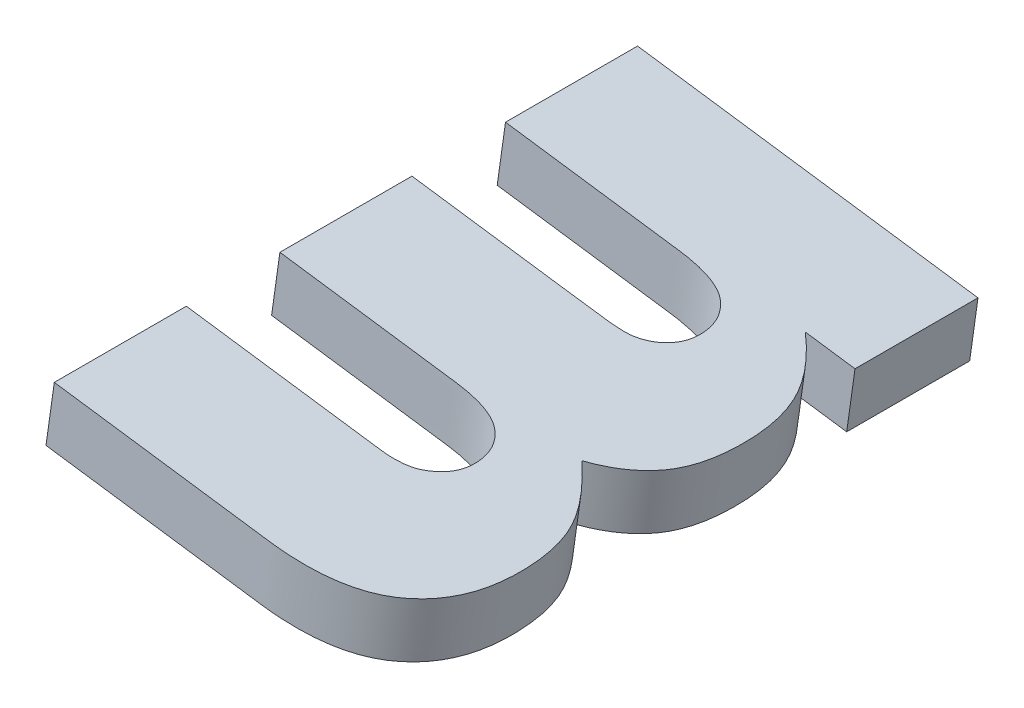
ISO-10303-21;
HEADER;
FILE_DESCRIPTION(('STEP AP214'),'2;1');
FILE_NAME('part.step','',(''),(''),'','','');
FILE_SCHEMA(('AUTOMOTIVE_DESIGN { 1 0 10303 214 1 1 1 1 }'));
ENDSEC;
DATA;
#1=APPLICATION_CONTEXT('core data for automotive mechanical design processes');
#2=APPLICATION_PROTOCOL_DEFINITION('international standard','automotive_design',2000,#1);
#3=PRODUCT_CONTEXT('',#1,'mechanical');
#4=PRODUCT('Part','Part','',(#3));
#5=PRODUCT_RELATED_PRODUCT_CATEGORY('part','',(#4));
#6=PRODUCT_DEFINITION_FORMATION('','',#4);
#7=PRODUCT_DEFINITION_CONTEXT('part definition',#1,'design');
#8=PRODUCT_DEFINITION('design','',#6,#7);
#9=PRODUCT_DEFINITION_SHAPE('','',#8);
#10=(LENGTH_UNIT() NAMED_UNIT(*) SI_UNIT(.MILLI.,.METRE.));
#11=(NAMED_UNIT(*) PLANE_ANGLE_UNIT() SI_UNIT($,.RADIAN.));
#12=(NAMED_UNIT(*) SI_UNIT($,.STERADIAN.) SOLID_ANGLE_UNIT());
#13=UNCERTAINTY_MEASURE_WITH_UNIT(LENGTH_MEASURE(1.E-05),#10,'distance_accuracy_value','');
#14=(GEOMETRIC_REPRESENTATION_CONTEXT(3) GLOBAL_UNCERTAINTY_ASSIGNED_CONTEXT((#13)) GLOBAL_UNIT_ASSIGNED_CONTEXT((#10,
#11,#12)) REPRESENTATION_CONTEXT('',''));
#15=CARTESIAN_POINT('',(0.,0.,0.));
#16=DIRECTION('',(0.,0.,1.));
#17=DIRECTION('',(1.,0.,0.));
#18=AXIS2_PLACEMENT_3D('',#15,#16,#17);
#19=CARTESIAN_POINT('',(861.909026522372,614.859563731179,2032.02306557489));
#20=DIRECTION('',(0.990268068741567,-0.139173100960088,0.));
#21=DIRECTION('',(-0.000106014336861748,-0.000754331202663064,-0.999999709872657));
#22=AXIS2_PLACEMENT_3D('',#19,#20,#21);
#23=PLANE('',#22);
#24=CARTESIAN_POINT('',(860.51729591655,604.956885916802,2032.03068301936));
#25=CARTESIAN_POINT('',(860.51839511022,604.964707086161,2042.39902926088));
#26=CARTESIAN_POINT('',(860.51949430389,604.97252825552,2052.7673755024));
#27=B_SPLINE_CURVE_WITH_KNOTS('',2,(#24,#25,#26),.UNSPECIFIED.,.F.,.F.,(3,3),(0.,1.),.UNSPECIFIED.);
#28=CARTESIAN_POINT('',(860.51729591655,604.956885916802,2032.03068301936));
#29=VERTEX_POINT('',#28);
#30=CARTESIAN_POINT('',(860.51949430389,604.97252825552,2052.7673755024));
#31=VERTEX_POINT('',#30);
#32=EDGE_CURVE('E135',#29,#31,#27,.T.);
#33=ORIENTED_EDGE('',*,*,#32,.F.);
#34=DIRECTION('',(-0.139173060582166,-0.990267781437723,0.000761744447259926));
#35=VECTOR('',#34,1.);
#36=CARTESIAN_POINT('',(861.909026522372,614.859563731179,2032.02306557489));
#37=LINE('',#36,#35);
#38=CARTESIAN_POINT('',(861.909026522372,614.859563731179,2032.02306557489));
#39=VERTEX_POINT('',#38);
#40=EDGE_CURVE('E33',#39,#29,#37,.T.);
#41=ORIENTED_EDGE('',*,*,#40,.F.);
#42=CARTESIAN_POINT('',(861.909026522372,614.859563731179,2032.02306557489));
#43=CARTESIAN_POINT('',(861.910125716042,614.867384900538,2042.39141181641));
#44=CARTESIAN_POINT('',(861.911224909712,614.875206069897,2052.75975805793));
#45=B_SPLINE_CURVE_WITH_KNOTS('',2,(#42,#43,#44),.UNSPECIFIED.,.F.,.F.,(3,3),(0.,1.),.UNSPECIFIED.);
#46=CARTESIAN_POINT('',(861.911224909712,614.875206069897,2052.75975805793));
#47=VERTEX_POINT('',#46);
#48=EDGE_CURVE('E211',#39,#47,#45,.T.);
#49=ORIENTED_EDGE('',*,*,#48,.T.);
#50=DIRECTION('',(-0.139173060582166,-0.990267781437723,0.000761744447259926));
#51=VECTOR('',#50,1.);
#52=CARTESIAN_POINT('',(861.911224909712,614.875206069897,2052.75975805793));
#53=LINE('',#52,#51);
#54=EDGE_CURVE('E11',#47,#31,#53,.T.);
#55=ORIENTED_EDGE('',*,*,#54,.T.);
#56=EDGE_LOOP('',(#33,#41,#49,#55));
#57=FACE_BOUND('',#56,.T.);
#58=ADVANCED_FACE('F17',(#57),#23,.T.);
#59=CARTESIAN_POINT('',(861.911224909712,614.875206069897,2052.75975805793));
#60=DIRECTION('',(0.000106014336872351,0.000754331202661565,0.999999709872657));
#61=DIRECTION('',(0.990268068741567,-0.139173100960088,0.));
#62=AXIS2_PLACEMENT_3D('',#59,#60,#61);
#63=PLANE('',#62);
#64=CARTESIAN_POINT('',(860.51949430389,604.97252825552,2052.7673755024));
#65=CARTESIAN_POINT('',(856.331457451095,605.561118450576,2052.7673755024));
#66=CARTESIAN_POINT('',(852.1434205983,606.149708645632,2052.7673755024));
#67=B_SPLINE_CURVE_WITH_KNOTS('',2,(#64,#65,#66),.UNSPECIFIED.,.F.,.F.,(3,3),(1.,2.),.UNSPECIFIED.);
#68=CARTESIAN_POINT('',(852.1434205983,606.149708645632,2052.7673755024));
#69=VERTEX_POINT('',#68);
#70=EDGE_CURVE('E143',#31,#69,#67,.T.);
#71=ORIENTED_EDGE('',*,*,#70,.F.);
#72=ORIENTED_EDGE('',*,*,#54,.F.);
#73=CARTESIAN_POINT('',(861.911224909712,614.875206069897,2052.75975805793));
#74=CARTESIAN_POINT('',(857.723188056917,615.463796264953,2052.75975805793));
#75=CARTESIAN_POINT('',(853.535151204121,616.05238646001,2052.75975805793));
#76=B_SPLINE_CURVE_WITH_KNOTS('',2,(#73,#74,#75),.UNSPECIFIED.,.F.,.F.,(3,3),(1.,2.),.UNSPECIFIED.);
#77=CARTESIAN_POINT('',(853.535151204121,616.05238646001,2052.75975805793));
#78=VERTEX_POINT('',#77);
#79=EDGE_CURVE('E227',#47,#78,#76,.T.);
#80=ORIENTED_EDGE('',*,*,#79,.T.);
#81=DIRECTION('',(-0.139173060582166,-0.990267781437723,0.000761744447259926));
#82=VECTOR('',#81,1.);
#83=CARTESIAN_POINT('',(853.535151204121,616.05238646001,2052.75975805793));
#84=LINE('',#83,#82);
#85=EDGE_CURVE('E25',#78,#69,#84,.T.);
#86=ORIENTED_EDGE('',*,*,#85,.T.);
#87=EDGE_LOOP('',(#71,#72,#80,#86));
#88=FACE_BOUND('',#87,.T.);
#89=ADVANCED_FACE('F226',(#88),#63,.T.);
#90=CARTESIAN_POINT('',(853.535151204121,616.05238646001,2052.75975805793));
#91=CARTESIAN_POINT('',(858.777427280266,615.31907997471,2057.24133929521));
#92=CARTESIAN_POINT('',(860.993517618006,615.01113879677,2061.80434956754));
#93=CARTESIAN_POINT('',(863.209607955746,614.70319761883,2066.36735983987));
#94=CARTESIAN_POINT('',(863.210291607204,614.708062051714,2072.81602781886));
#95=CARTESIAN_POINT('',(863.211027416125,614.713297604228,2079.7566806483));
#96=CARTESIAN_POINT('',(860.779692822011,615.058110294934,2083.80084727852));
#97=CARTESIAN_POINT('',(858.348358227898,615.402922985639,2087.84501390874));
#98=CARTESIAN_POINT('',(853.539143012713,616.080789653998,2090.41322598765));
#99=B_SPLINE_CURVE_WITH_KNOTS('',2,(#90,#91,#92,#93,#94,#95,#96,#97,#98),.UNSPECIFIED.,.F.,.F.,
(3,2,2,2,3),(2.,3.,4.,5.,6.),.UNSPECIFIED.);
#100=DIRECTION('',(-0.139173060582166,-0.990267781437723,0.000761744447259926));
#101=VECTOR('',#100,1.);
#102=SURFACE_OF_LINEAR_EXTRUSION('',#99,#101);
#103=CARTESIAN_POINT('',(852.1434205983,606.149708645632,2052.7673755024));
#104=CARTESIAN_POINT('',(857.385696674444,605.416402160333,2057.24895673969));
#105=CARTESIAN_POINT('',(859.601787012185,605.108460982393,2061.81196701201));
#106=CARTESIAN_POINT('',(861.817877349925,604.800519804453,2066.37497728434));
#107=CARTESIAN_POINT('',(861.818561001382,604.805384237336,2072.82364526334));
#108=CARTESIAN_POINT('',(861.819296810303,604.810619789851,2079.76429809277));
#109=CARTESIAN_POINT('',(859.38796221619,605.155432480557,2083.808464723));
#110=CARTESIAN_POINT('',(856.956627622077,605.500245171262,2087.85263135321));
#111=CARTESIAN_POINT('',(852.147412406891,606.178111839621,2090.42084343212));
#112=B_SPLINE_CURVE_WITH_KNOTS('',2,(#103,#104,#105,#106,#107,#108,#109,#110,#111),
.UNSPECIFIED.,.F.,.F.,(3,2,2,2,3),(2.,3.,4.,5.,6.),.UNSPECIFIED.);
#113=CARTESIAN_POINT('',(852.147412406891,606.178111839621,2090.42084343212));
#114=VERTEX_POINT('',#113);
#115=EDGE_CURVE('E151',#69,#114,#112,.T.);
#116=ORIENTED_EDGE('',*,*,#115,.F.);
#117=ORIENTED_EDGE('',*,*,#85,.F.);
#118=CARTESIAN_POINT('',(853.539143012713,616.080789653998,2090.41322598765));
#119=VERTEX_POINT('',#118);
#120=EDGE_CURVE('E236',#78,#119,#99,.T.);
#121=ORIENTED_EDGE('',*,*,#120,.T.);
#122=DIRECTION('',(-0.139173060582166,-0.990267781437723,0.000761744447259926));
#123=VECTOR('',#122,1.);
#124=CARTESIAN_POINT('',(853.539143012713,616.080789653998,2090.41322598765));
#125=LINE('',#124,#123);
#126=EDGE_CURVE('E224',#119,#114,#125,.T.);
#127=ORIENTED_EDGE('',*,*,#126,.T.);
#128=EDGE_LOOP('',(#116,#117,#121,#127));
#129=FACE_BOUND('',#128,.T.);
#130=ADVANCED_FACE('F231',(#129),#102,.T.);
#131=CARTESIAN_POINT('',(853.539143012713,616.080789653998,2090.41322598765));
#132=CARTESIAN_POINT('',(859.159772932149,615.294886189016,2095.64514807136));
#133=CARTESIAN_POINT('',(861.186698777448,615.013331939304,2099.95022867773));
#134=CARTESIAN_POINT('',(863.213624622747,614.731777689593,2104.25530928409));
#135=CARTESIAN_POINT('',(863.214294805467,614.736546287424,2110.57693091523));
#136=CARTESIAN_POINT('',(863.215282723857,614.743575692023,2119.8956526318));
#137=CARTESIAN_POINT('',(857.730860040039,615.51838526137,2125.12714838549));
#138=CARTESIAN_POINT('',(852.246437356221,616.293194830718,2130.35864413917));
#139=CARTESIAN_POINT('',(840.573973353592,617.933652664681,2130.35864413917));
#140=CARTESIAN_POINT('',(822.551905090274,620.466489181472,2130.35864413917));
#141=CARTESIAN_POINT('',(804.529836826955,622.999325698262,2130.35864413917));
#142=B_SPLINE_CURVE_WITH_KNOTS('',2,(#131,#132,#133,#134,#135,#136,#137,#138,#139,#140,#141),
.UNSPECIFIED.,.F.,.F.,(3,2,2,2,2,3),(6.,7.,8.,9.,10.,11.),.UNSPECIFIED.);
#143=DIRECTION('',(-0.139173060582166,-0.990267781437723,0.000761744447259926));
#144=VECTOR('',#143,1.);
#145=SURFACE_OF_LINEAR_EXTRUSION('',#142,#144);
#146=CARTESIAN_POINT('',(852.147412406891,606.178111839621,2090.42084343212));
#147=CARTESIAN_POINT('',(857.768042326327,605.392208374639,2095.65276551583));
#148=CARTESIAN_POINT('',(859.794968171627,605.110654124927,2099.9578461222));
#149=CARTESIAN_POINT('',(861.821894016925,604.829099875215,2104.26292672857));
#150=CARTESIAN_POINT('',(861.822564199645,604.833868473047,2110.5845483597));
#151=CARTESIAN_POINT('',(861.823552118035,604.840897877646,2119.90327007628));
#152=CARTESIAN_POINT('',(856.339129434217,605.615707446993,2125.13476582996));
#153=CARTESIAN_POINT('',(850.8547067504,606.390517016341,2130.36626158365));
#154=CARTESIAN_POINT('',(839.18224274777,608.030974850304,2130.36626158365));
#155=CARTESIAN_POINT('',(821.160174484452,610.563811367095,2130.36626158365));
#156=CARTESIAN_POINT('',(803.138106221133,613.096647883885,2130.36626158365));
#157=B_SPLINE_CURVE_WITH_KNOTS('',2,(#146,#147,#148,#149,#150,#151,#152,#153,#154,#155,#156),
.UNSPECIFIED.,.F.,.F.,(3,2,2,2,2,3),(6.,7.,8.,9.,10.,11.),.UNSPECIFIED.);
#158=CARTESIAN_POINT('',(803.138106221133,613.096647883885,2130.36626158365));
#159=VERTEX_POINT('',#158);
#160=EDGE_CURVE('E159',#114,#159,#157,.T.);
#161=ORIENTED_EDGE('',*,*,#160,.F.);
#162=ORIENTED_EDGE('',*,*,#126,.F.);
#163=CARTESIAN_POINT('',(804.529836826955,622.999325698262,2130.35864413917));
#164=VERTEX_POINT('',#163);
#165=EDGE_CURVE('E253',#119,#164,#142,.T.);
#166=ORIENTED_EDGE('',*,*,#165,.T.);
#167=DIRECTION('',(-0.139173060582166,-0.990267781437723,0.000761744447259926));
#168=VECTOR('',#167,1.);
#169=CARTESIAN_POINT('',(804.529836826955,622.999325698262,2130.35864413917));
#170=LINE('',#169,#168);
#171=EDGE_CURVE('E222',#164,#159,#170,.T.);
#172=ORIENTED_EDGE('',*,*,#171,.T.);
#173=EDGE_LOOP('',(#161,#162,#166,#172));
#174=FACE_BOUND('',#173,.T.);
#175=ADVANCED_FACE('F264',(#174),#145,.T.);
#176=CARTESIAN_POINT('',(804.529836826955,622.999325698262,2130.35864413917));
#177=DIRECTION('',(-0.990268068741567,0.139173100960088,0.));
#178=DIRECTION('',(0.000106014336857696,0.000754331202663619,0.999999709872657));
#179=AXIS2_PLACEMENT_3D('',#176,#177,#178);
#180=PLANE('',#179);
#181=CARTESIAN_POINT('',(803.138106221133,613.096647883885,2130.36626158365));
#182=CARTESIAN_POINT('',(803.136926034245,613.088250417836,2119.23393193486));
#183=CARTESIAN_POINT('',(803.135745847358,613.079852951788,2108.10160228608));
#184=B_SPLINE_CURVE_WITH_KNOTS('',2,(#181,#182,#183),.UNSPECIFIED.,.F.,.F.,(3,3),(11.,12.),.UNSPECIFIED.);
#185=CARTESIAN_POINT('',(803.135745847358,613.079852951788,2108.10160228608));
#186=VERTEX_POINT('',#185);
#187=EDGE_CURVE('E167',#159,#186,#184,.T.);
#188=ORIENTED_EDGE('',*,*,#187,.F.);
#189=ORIENTED_EDGE('',*,*,#171,.F.);
#190=CARTESIAN_POINT('',(804.529836826955,622.999325698262,2130.35864413917));
#191=CARTESIAN_POINT('',(804.528656640067,622.990928232214,2119.22631449039));
#192=CARTESIAN_POINT('',(804.527476453179,622.982530766165,2108.0939848416));
#193=B_SPLINE_CURVE_WITH_KNOTS('',2,(#190,#191,#192),.UNSPECIFIED.,.F.,.F.,(3,3),(11.,12.),.UNSPECIFIED.);
#194=CARTESIAN_POINT('',(804.527476453179,622.982530766165,2108.0939848416));
#195=VERTEX_POINT('',#194);
#196=EDGE_CURVE('E378',#164,#195,#193,.T.);
#197=ORIENTED_EDGE('',*,*,#196,.T.);
#198=DIRECTION('',(-0.139173060582166,-0.990267781437723,0.000761744447259926));
#199=VECTOR('',#198,1.);
#200=CARTESIAN_POINT('',(804.527476453179,622.982530766165,2108.0939848416));
#201=LINE('',#200,#199);
#202=EDGE_CURVE('E220',#195,#186,#201,.T.);
#203=ORIENTED_EDGE('',*,*,#202,.T.);
#204=EDGE_LOOP('',(#188,#189,#197,#203));
#205=FACE_BOUND('',#204,.T.);
#206=ADVANCED_FACE('F299',(#205),#180,.T.);
#207=CARTESIAN_POINT('',(804.527476453179,622.982530766165,2108.0939848416));
#208=CARTESIAN_POINT('',(820.87432997538,620.685130327397,2108.0939848416));
#209=CARTESIAN_POINT('',(837.22118349758,618.387729888629,2108.0939848416));
#210=CARTESIAN_POINT('',(841.11200483179,617.840910610641,2108.0939848416));
#211=CARTESIAN_POINT('',(843.033566135828,617.569712209839,2106.61124228053));
#212=CARTESIAN_POINT('',(845.975133674606,617.154555841581,2104.34142794942));
#213=CARTESIAN_POINT('',(845.974782041105,617.152053839213,2101.0245803442));
#214=CARTESIAN_POINT('',(845.974366950864,617.149100318678,2097.10916538194));
#215=CARTESIAN_POINT('',(843.164075629233,617.542220244902,2094.71617494388));
#216=CARTESIAN_POINT('',(840.353784307603,617.935340171125,2092.32318450582));
#217=CARTESIAN_POINT('',(834.139278009907,618.808732073467,2092.32318450582));
#218=CARTESIAN_POINT('',(819.332541265831,620.889683214698,2092.32318450582));
#219=CARTESIAN_POINT('',(804.525804521755,622.970634355929,2092.32318450582));
#220=B_SPLINE_CURVE_WITH_KNOTS('',2,(#207,#208,#209,#210,#211,#212,#213,#214,#215,#216,#217,
#218,#219),.UNSPECIFIED.,.F.,.F.,(3,2,2,2,2,2,3),(12.,13.,14.,15.,16.,17.,18.),.UNSPECIFIED.);
#221=DIRECTION('',(-0.139173060582166,-0.990267781437723,0.000761744447259926));
#222=VECTOR('',#221,1.);
#223=SURFACE_OF_LINEAR_EXTRUSION('',#220,#222);
#224=CARTESIAN_POINT('',(803.135745847358,613.079852951788,2108.10160228608));
#225=CARTESIAN_POINT('',(819.482599369558,610.78245251302,2108.10160228608));
#226=CARTESIAN_POINT('',(835.829452891759,608.485052074252,2108.10160228608));
#227=CARTESIAN_POINT('',(839.720274225968,607.938232796264,2108.10160228608));
#228=CARTESIAN_POINT('',(841.641835530006,607.667034395462,2106.61885972501));
#229=CARTESIAN_POINT('',(844.583403068784,607.251878027204,2104.3490453939));
#230=CARTESIAN_POINT('',(844.583051435283,607.249376024835,2101.03219778867));
#231=CARTESIAN_POINT('',(844.582636345042,607.246422504301,2097.11678282642));
#232=CARTESIAN_POINT('',(841.772345023411,607.639542430524,2094.72379238835));
#233=CARTESIAN_POINT('',(838.962053701781,608.032662356748,2092.3308019503));
#234=CARTESIAN_POINT('',(832.747547404085,608.906054259089,2092.3308019503));
#235=CARTESIAN_POINT('',(817.940810660009,610.987005400321,2092.3308019503));
#236=CARTESIAN_POINT('',(803.134073915933,613.067956541552,2092.3308019503));
#237=B_SPLINE_CURVE_WITH_KNOTS('',2,(#224,#225,#226,#227,#228,#229,#230,#231,#232,#233,#234,
#235,#236),.UNSPECIFIED.,.F.,.F.,(3,2,2,2,2,2,3),(12.,13.,14.,15.,16.,17.,18.),.UNSPECIFIED.);
#238=CARTESIAN_POINT('',(803.134073915933,613.067956541552,2092.3308019503));
#239=VERTEX_POINT('',#238);
#240=EDGE_CURVE('E175',#186,#239,#237,.T.);
#241=ORIENTED_EDGE('',*,*,#240,.F.);
#242=ORIENTED_EDGE('',*,*,#202,.F.);
#243=CARTESIAN_POINT('',(804.525804521755,622.970634355929,2092.32318450582));
#244=VERTEX_POINT('',#243);
#245=EDGE_CURVE('E373',#195,#244,#220,.T.);
#246=ORIENTED_EDGE('',*,*,#245,.T.);
#247=DIRECTION('',(-0.139173060582166,-0.990267781437723,0.000761744447259926));
#248=VECTOR('',#247,1.);
#249=CARTESIAN_POINT('',(804.525804521755,622.970634355929,2092.32318450582));
#250=LINE('',#249,#248);
#251=EDGE_CURVE('E218',#244,#239,#250,.T.);
#252=ORIENTED_EDGE('',*,*,#251,.T.);
#253=EDGE_LOOP('',(#241,#242,#246,#252));
#254=FACE_BOUND('',#253,.T.);
#255=ADVANCED_FACE('F308',(#254),#223,.T.);
#256=CARTESIAN_POINT('',(804.525804521755,622.970634355929,2092.32318450582));
#257=DIRECTION('',(-0.990268068741567,0.139173100960088,0.));
#258=DIRECTION('',(0.000106014336863525,0.000754331202662807,0.999999709872657));
#259=AXIS2_PLACEMENT_3D('',#256,#257,#258);
#260=PLANE('',#259);
#261=CARTESIAN_POINT('',(803.134073915933,613.067956541552,2092.3308019503));
#262=CARTESIAN_POINT('',(803.132893729045,613.059559075503,2081.19847230151));
#263=CARTESIAN_POINT('',(803.131713542157,613.051161609455,2070.06614265272));
#264=B_SPLINE_CURVE_WITH_KNOTS('',2,(#261,#262,#263),.UNSPECIFIED.,.F.,.F.,(3,3),(18.,19.),.UNSPECIFIED.);
#265=CARTESIAN_POINT('',(803.131713542157,613.051161609455,2070.06614265272));
#266=VERTEX_POINT('',#265);
#267=EDGE_CURVE('E183',#239,#266,#264,.T.);
#268=ORIENTED_EDGE('',*,*,#267,.F.);
#269=ORIENTED_EDGE('',*,*,#251,.F.);
#270=CARTESIAN_POINT('',(804.525804521755,622.970634355929,2092.32318450582));
#271=CARTESIAN_POINT('',(804.524624334867,622.962236889881,2081.19085485703));
#272=CARTESIAN_POINT('',(804.523444147979,622.953839423832,2070.05852520824));
#273=B_SPLINE_CURVE_WITH_KNOTS('',2,(#270,#271,#272),.UNSPECIFIED.,.F.,.F.,(3,3),(18.,19.),.UNSPECIFIED.);
#274=CARTESIAN_POINT('',(804.523444147979,622.953839423832,2070.05852520824));
#275=VERTEX_POINT('',#274);
#276=EDGE_CURVE('E116',#244,#275,#273,.T.);
#277=ORIENTED_EDGE('',*,*,#276,.T.);
#278=DIRECTION('',(-0.139173060582166,-0.990267781437723,0.000761744447259926));
#279=VECTOR('',#278,1.);
#280=CARTESIAN_POINT('',(804.523444147979,622.953839423832,2070.05852520824));
#281=LINE('',#280,#279);
#282=EDGE_CURVE('E108',#275,#266,#281,.T.);
#283=ORIENTED_EDGE('',*,*,#282,.T.);
#284=EDGE_LOOP('',(#268,#269,#277,#283));
#285=FACE_BOUND('',#284,.T.);
#286=ADVANCED_FACE('F317',(#285),#260,.T.);
#287=CARTESIAN_POINT('',(804.523444147979,622.953839423832,2070.05852520824));
#288=CARTESIAN_POINT('',(820.329905818206,620.732386107006,2070.05852520824));
#289=CARTESIAN_POINT('',(836.136367488433,618.510932790181,2070.05852520824));
#290=CARTESIAN_POINT('',(839.919110452247,617.979302936582,2070.05852520824));
#291=CARTESIAN_POINT('',(841.268842561228,617.789270454582,2069.61651899485));
#292=CARTESIAN_POINT('',(843.431535548278,617.484778982978,2068.90828679708));
#293=CARTESIAN_POINT('',(844.755309825499,617.297386782324,2067.15607038866));
#294=CARTESIAN_POINT('',(846.07908410272,617.10999458167,2065.40385398025));
#295=CARTESIAN_POINT('',(846.078834524289,617.108218738858,2063.04965957459));
#296=CARTESIAN_POINT('',(846.078428111892,617.105326964397,2059.2160999774));
#297=CARTESIAN_POINT('',(843.214090057147,617.505987896595,2056.75191242493));
#298=CARTESIAN_POINT('',(840.349752002402,617.906648828792,2054.28772487247));
#299=CARTESIAN_POINT('',(833.811010593522,618.825609004299,2054.28772487247));
#300=CARTESIAN_POINT('',(819.166391405038,620.883776008948,2054.28772487247));
#301=CARTESIAN_POINT('',(804.521772216554,622.941943013596,2054.28772487247));
#302=B_SPLINE_CURVE_WITH_KNOTS('',2,(#287,#288,#289,#290,#291,#292,#293,#294,#295,#296,#297,
#298,#299,#300,#301),.UNSPECIFIED.,.F.,.F.,(3,2,2,2,2,2,2,3),(19.,20.,21.,22.,23.,24.,25.,26.),.UNSPECIFIED.);
#303=DIRECTION('',(-0.139173060582166,-0.990267781437723,0.000761744447259926));
#304=VECTOR('',#303,1.);
#305=SURFACE_OF_LINEAR_EXTRUSION('',#302,#304);
#306=CARTESIAN_POINT('',(803.131713542157,613.051161609455,2070.06614265272));
#307=CARTESIAN_POINT('',(818.938175212384,610.829708292629,2070.06614265272));
#308=CARTESIAN_POINT('',(834.744636882611,608.608254975804,2070.06614265272));
#309=CARTESIAN_POINT('',(838.527379846426,608.076625122205,2070.06614265272));
#310=CARTESIAN_POINT('',(839.877111955406,607.886592640204,2069.62413643932));
#311=CARTESIAN_POINT('',(842.039804942456,607.582101168601,2068.91590424155));
#312=CARTESIAN_POINT('',(843.363579219677,607.394708967947,2067.16368783313));
#313=CARTESIAN_POINT('',(844.687353496898,607.207316767293,2065.41147142472));
#314=CARTESIAN_POINT('',(844.687103918467,607.205540924481,2063.05727701906));
#315=CARTESIAN_POINT('',(844.686697506071,607.20264915002,2059.22371742187));
#316=CARTESIAN_POINT('',(841.822359451325,607.603310082218,2056.75952986941));
#317=CARTESIAN_POINT('',(838.95802139658,608.003971014415,2054.29534231694));
#318=CARTESIAN_POINT('',(832.4192799877,608.922931189922,2054.29534231694));
#319=CARTESIAN_POINT('',(817.774660799216,610.98109819457,2054.29534231694));
#320=CARTESIAN_POINT('',(803.130041610733,613.039265199219,2054.29534231694));
#321=B_SPLINE_CURVE_WITH_KNOTS('',2,(#306,#307,#308,#309,#310,#311,#312,#313,#314,#315,#316,
#317,#318,#319,#320),.UNSPECIFIED.,.F.,.F.,(3,2,2,2,2,2,2,3),(19.,20.,21.,22.,23.,24.,25.,26.),.UNSPECIFIED.);
#322=CARTESIAN_POINT('',(803.130041610733,613.039265199219,2054.29534231694));
#323=VERTEX_POINT('',#322);
#324=EDGE_CURVE('E191',#266,#323,#321,.T.);
#325=ORIENTED_EDGE('',*,*,#324,.F.);
#326=ORIENTED_EDGE('',*,*,#282,.F.);
#327=CARTESIAN_POINT('',(804.521772216554,622.941943013596,2054.28772487247));
#328=VERTEX_POINT('',#327);
#329=EDGE_CURVE('E111',#275,#328,#302,.T.);
#330=ORIENTED_EDGE('',*,*,#329,.T.);
#331=DIRECTION('',(-0.139173060582166,-0.990267781437723,0.000761744447259926));
#332=VECTOR('',#331,1.);
#333=CARTESIAN_POINT('',(804.521772216554,622.941943013596,2054.28772487247));
#334=LINE('',#333,#332);
#335=EDGE_CURVE('E97',#328,#323,#334,.T.);
#336=ORIENTED_EDGE('',*,*,#335,.T.);
#337=EDGE_LOOP('',(#325,#326,#330,#336));
#338=FACE_BOUND('',#337,.T.);
#339=ADVANCED_FACE('F112',(#338),#305,.T.);
#340=CARTESIAN_POINT('',(804.521772216554,622.941943013596,2054.28772487247));
#341=DIRECTION('',(-0.990268068741567,0.139173100960088,0.));
#342=DIRECTION('',(0.000106014336863525,0.000754331202662807,0.999999709872657));
#343=AXIS2_PLACEMENT_3D('',#340,#341,#342);
#344=PLANE('',#343);
#345=CARTESIAN_POINT('',(803.130041610733,613.039265199219,2054.29534231694));
#346=CARTESIAN_POINT('',(803.128861423845,613.03086773317,2043.16301266815));
#347=CARTESIAN_POINT('',(803.127681236957,613.022470267121,2032.03068301936));
#348=B_SPLINE_CURVE_WITH_KNOTS('',2,(#345,#346,#347),.UNSPECIFIED.,.F.,.F.,(3,3),(26.,27.),.UNSPECIFIED.);
#349=CARTESIAN_POINT('',(803.127681236957,613.022470267121,2032.03068301936));
#350=VERTEX_POINT('',#349);
#351=EDGE_CURVE('E104',#323,#350,#348,.T.);
#352=ORIENTED_EDGE('',*,*,#351,.F.);
#353=ORIENTED_EDGE('',*,*,#335,.F.);
#354=CARTESIAN_POINT('',(804.521772216554,622.941943013596,2054.28772487247));
#355=CARTESIAN_POINT('',(804.520592029666,622.933545547547,2043.15539522367));
#356=CARTESIAN_POINT('',(804.519411842779,622.925148081499,2032.02306557489));
#357=B_SPLINE_CURVE_WITH_KNOTS('',2,(#354,#355,#356),.UNSPECIFIED.,.F.,.F.,(3,3),(26.,27.),.UNSPECIFIED.);
#358=CARTESIAN_POINT('',(804.519411842779,622.925148081499,2032.02306557489));
#359=VERTEX_POINT('',#358);
#360=EDGE_CURVE('E101',#328,#359,#357,.T.);
#361=ORIENTED_EDGE('',*,*,#360,.T.);
#362=DIRECTION('',(-0.139173060582166,-0.990267781437723,0.000761744447259926));
#363=VECTOR('',#362,1.);
#364=CARTESIAN_POINT('',(804.519411842779,622.925148081499,2032.02306557489));
#365=LINE('',#364,#363);
#366=EDGE_CURVE('E67',#359,#350,#365,.T.);
#367=ORIENTED_EDGE('',*,*,#366,.T.);
#368=EDGE_LOOP('',(#352,#353,#361,#367));
#369=FACE_BOUND('',#368,.T.);
#370=ADVANCED_FACE('F99',(#369),#344,.T.);
#371=CARTESIAN_POINT('',(804.519411842779,622.925148081499,2032.02306557489));
#372=DIRECTION('',(-0.000106014336866911,-0.000754331202662335,-0.999999709872657));
#373=DIRECTION('',(-0.990268068741567,0.139173100960088,0.));
#374=AXIS2_PLACEMENT_3D('',#371,#372,#373);
#375=PLANE('',#374);
#376=CARTESIAN_POINT('',(803.127681236957,613.022470267121,2032.03068301936));
#377=CARTESIAN_POINT('',(831.822488576753,608.989678091962,2032.03068301936));
#378=CARTESIAN_POINT('',(860.51729591655,604.956885916802,2032.03068301936));
#379=B_SPLINE_CURVE_WITH_KNOTS('',2,(#376,#377,#378),.UNSPECIFIED.,.F.,.F.,(3,3),(27.,28.),.UNSPECIFIED.);
#380=EDGE_CURVE('E204',#350,#29,#379,.T.);
#381=ORIENTED_EDGE('',*,*,#380,.F.);
#382=ORIENTED_EDGE('',*,*,#366,.F.);
#383=CARTESIAN_POINT('',(804.519411842779,622.925148081499,2032.02306557489));
#384=CARTESIAN_POINT('',(833.214219182575,618.892355906339,2032.02306557489));
#385=CARTESIAN_POINT('',(861.909026522372,614.859563731179,2032.02306557489));
#386=B_SPLINE_CURVE_WITH_KNOTS('',2,(#383,#384,#385),.UNSPECIFIED.,.F.,.F.,(3,3),(27.,28.),.UNSPECIFIED.);
#387=EDGE_CURVE('E120',#359,#39,#386,.T.);
#388=ORIENTED_EDGE('',*,*,#387,.T.);
#389=ORIENTED_EDGE('',*,*,#40,.T.);
#390=EDGE_LOOP('',(#381,#382,#388,#389));
#391=FACE_BOUND('',#390,.T.);
#392=ADVANCED_FACE('F344',(#391),#375,.T.);
#393=CARTESIAN_POINT('',(863.210291607204,614.708062051714,2072.81602781886));
#394=DIRECTION('',(0.1391730605822,0.990267781437718,-0.000761744447301527));
#395=DIRECTION('',(0.28642082499883,-0.0409901500376092,-0.957226680889582));
#396=AXIS2_PLACEMENT_3D('',#393,#394,#395);
#397=PLANE('',#396);
#398=ORIENTED_EDGE('',*,*,#48,.F.);
#399=ORIENTED_EDGE('',*,*,#387,.F.);
#400=ORIENTED_EDGE('',*,*,#360,.F.);
#401=ORIENTED_EDGE('',*,*,#329,.F.);
#402=ORIENTED_EDGE('',*,*,#276,.F.);
#403=ORIENTED_EDGE('',*,*,#245,.F.);
#404=ORIENTED_EDGE('',*,*,#196,.F.);
#405=ORIENTED_EDGE('',*,*,#165,.F.);
#406=ORIENTED_EDGE('',*,*,#120,.F.);
#407=ORIENTED_EDGE('',*,*,#79,.F.);
#408=EDGE_LOOP('',(#398,#399,#400,#401,#402,#403,#404,#405,#406,#407));
#409=FACE_BOUND('',#408,.T.);
#410=ADVANCED_FACE('F119',(#409),#397,.T.);
#411=CARTESIAN_POINT('',(861.818561001382,604.805384237336,2072.82364526334));
#412=DIRECTION('',(0.1391730605822,0.990267781437718,-0.000761744447301527));
#413=DIRECTION('',(0.28642082499883,-0.0409901500376092,-0.957226680889582));
#414=AXIS2_PLACEMENT_3D('',#411,#412,#413);
#415=PLANE('',#414);
#416=ORIENTED_EDGE('',*,*,#32,.T.);
#417=ORIENTED_EDGE('',*,*,#70,.T.);
#418=ORIENTED_EDGE('',*,*,#115,.T.);
#419=ORIENTED_EDGE('',*,*,#160,.T.);
#420=ORIENTED_EDGE('',*,*,#187,.T.);
#421=ORIENTED_EDGE('',*,*,#240,.T.);
#422=ORIENTED_EDGE('',*,*,#267,.T.);
#423=ORIENTED_EDGE('',*,*,#324,.T.);
#424=ORIENTED_EDGE('',*,*,#351,.T.);
#425=ORIENTED_EDGE('',*,*,#380,.T.);
#426=EDGE_LOOP('',(#416,#417,#418,#419,#420,#421,#422,#423,#424,#425));
#427=FACE_BOUND('',#426,.T.);
#428=ADVANCED_FACE('F234',(#427),#415,.F.);
#429=CLOSED_SHELL('',(#58,#89,#130,#175,#206,#255,#286,#339,#370,#392,#410,#428));
#430=MANIFOLD_SOLID_BREP('B1',#429);
#431=ADVANCED_BREP_SHAPE_REPRESENTATION('',(#18,#430),#14);
#432=SHAPE_DEFINITION_REPRESENTATION(#9,#431);
ENDSEC;
END-ISO-10303-21;
